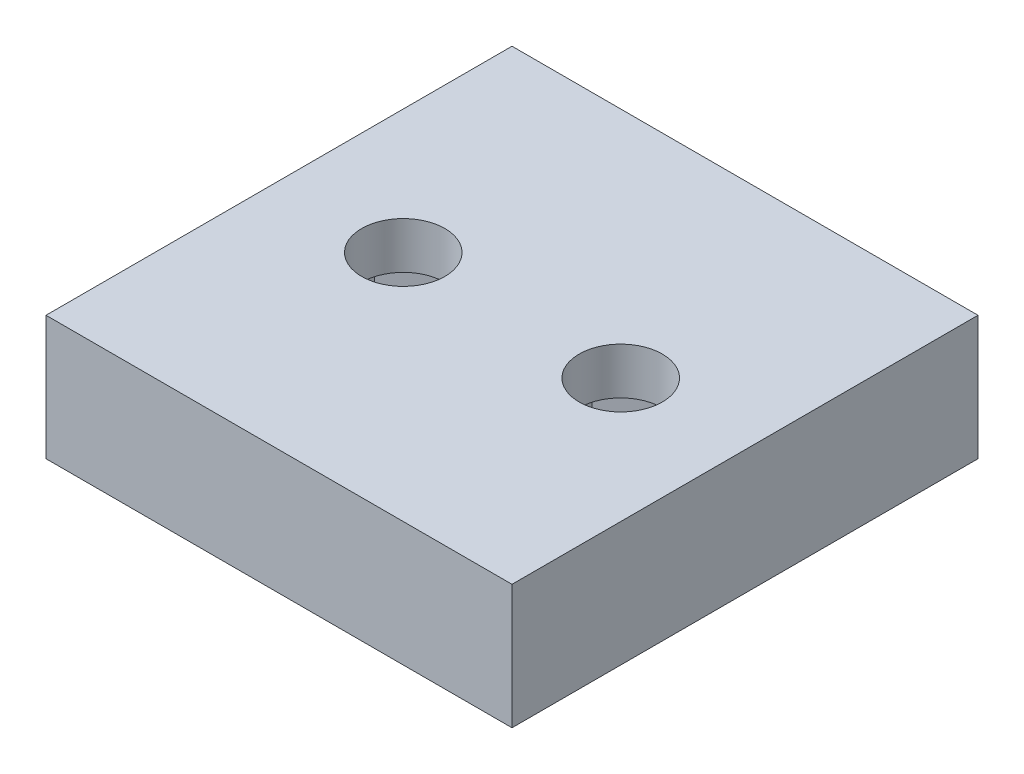
ISO-10303-21;
HEADER;
FILE_DESCRIPTION(('STEP AP214'),'2;1');
FILE_NAME('part.step','',(''),(''),'','','');
FILE_SCHEMA(('AUTOMOTIVE_DESIGN { 1 0 10303 214 1 1 1 1 }'));
ENDSEC;
DATA;
#1=APPLICATION_CONTEXT('core data for automotive mechanical design processes');
#2=APPLICATION_PROTOCOL_DEFINITION('international standard','automotive_design',2000,#1);
#3=PRODUCT_CONTEXT('',#1,'mechanical');
#4=PRODUCT('Part','Part','',(#3));
#5=PRODUCT_RELATED_PRODUCT_CATEGORY('part','',(#4));
#6=PRODUCT_DEFINITION_FORMATION('','',#4);
#7=PRODUCT_DEFINITION_CONTEXT('part definition',#1,'design');
#8=PRODUCT_DEFINITION('design','',#6,#7);
#9=PRODUCT_DEFINITION_SHAPE('','',#8);
#10=(LENGTH_UNIT() NAMED_UNIT(*) SI_UNIT(.MILLI.,.METRE.));
#11=(NAMED_UNIT(*) PLANE_ANGLE_UNIT() SI_UNIT($,.RADIAN.));
#12=(NAMED_UNIT(*) SI_UNIT($,.STERADIAN.) SOLID_ANGLE_UNIT());
#13=UNCERTAINTY_MEASURE_WITH_UNIT(LENGTH_MEASURE(1.E-05),#10,'distance_accuracy_value','');
#14=(GEOMETRIC_REPRESENTATION_CONTEXT(3) GLOBAL_UNCERTAINTY_ASSIGNED_CONTEXT((#13)) GLOBAL_UNIT_ASSIGNED_CONTEXT((#10,
#11,#12)) REPRESENTATION_CONTEXT('',''));
#15=CARTESIAN_POINT('',(0.,0.,0.));
#16=DIRECTION('',(0.,0.,1.));
#17=DIRECTION('',(1.,0.,0.));
#18=AXIS2_PLACEMENT_3D('',#15,#16,#17);
#19=CARTESIAN_POINT('',(-4.445,0.,0.));
#20=DIRECTION('',(0.,-1.,0.));
#21=DIRECTION('',(0.,0.,-1.));
#22=AXIS2_PLACEMENT_3D('',#19,#20,#21);
#23=CYLINDRICAL_SURFACE('',#22,1.7);
#24=CARTESIAN_POINT('',(-4.445,5.08,0.));
#25=DIRECTION('',(0.,-1.,0.));
#26=DIRECTION('',(0.,0.,-1.));
#27=AXIS2_PLACEMENT_3D('',#24,#25,#26);
#28=CIRCLE('',#27,1.7);
#29=CARTESIAN_POINT('',(-4.445,5.08,-1.7));
#30=VERTEX_POINT('',#29);
#31=EDGE_CURVE('E297',#30,#30,#28,.T.);
#32=ORIENTED_EDGE('',*,*,#31,.F.);
#33=EDGE_LOOP('',(#32));
#34=FACE_BOUND('',#33,.T.);
#35=CARTESIAN_POINT('',(-4.445,3.175,0.));
#36=DIRECTION('',(0.,-1.,0.));
#37=DIRECTION('',(0.,0.,-1.));
#38=AXIS2_PLACEMENT_3D('',#35,#36,#37);
#39=CIRCLE('',#38,1.7);
#40=CARTESIAN_POINT('',(-4.445,3.175,-1.7));
#41=VERTEX_POINT('',#40);
#42=EDGE_CURVE('E43',#41,#41,#39,.F.);
#43=ORIENTED_EDGE('',*,*,#42,.F.);
#44=EDGE_LOOP('',(#43));
#45=FACE_BOUND('',#44,.T.);
#46=ADVANCED_FACE('F39',(#34,#45),#23,.F.);
#47=CARTESIAN_POINT('',(4.445,0.,0.));
#48=DIRECTION('',(0.,-1.,0.));
#49=DIRECTION('',(0.,0.,-1.));
#50=AXIS2_PLACEMENT_3D('',#47,#48,#49);
#51=CYLINDRICAL_SURFACE('',#50,1.7);
#52=CARTESIAN_POINT('',(4.445,5.08,0.));
#53=DIRECTION('',(0.,-1.,0.));
#54=DIRECTION('',(0.,0.,-1.));
#55=AXIS2_PLACEMENT_3D('',#52,#53,#54);
#56=CIRCLE('',#55,1.7);
#57=CARTESIAN_POINT('',(4.445,5.08,-1.7));
#58=VERTEX_POINT('',#57);
#59=EDGE_CURVE('E293',#58,#58,#56,.T.);
#60=ORIENTED_EDGE('',*,*,#59,.F.);
#61=EDGE_LOOP('',(#60));
#62=FACE_BOUND('',#61,.T.);
#63=CARTESIAN_POINT('',(4.445,3.175,0.));
#64=DIRECTION('',(0.,-1.,0.));
#65=DIRECTION('',(0.,0.,-1.));
#66=AXIS2_PLACEMENT_3D('',#63,#64,#65);
#67=CIRCLE('',#66,1.7);
#68=CARTESIAN_POINT('',(4.445,3.175,-1.7));
#69=VERTEX_POINT('',#68);
#70=EDGE_CURVE('E218',#69,#69,#67,.F.);
#71=ORIENTED_EDGE('',*,*,#70,.F.);
#72=EDGE_LOOP('',(#71));
#73=FACE_BOUND('',#72,.T.);
#74=ADVANCED_FACE('F346',(#62,#73),#51,.F.);
#75=CARTESIAN_POINT('',(-9.525,5.08,-9.525));
#76=DIRECTION('',(1.,0.,0.));
#77=DIRECTION('',(0.,0.,-1.));
#78=AXIS2_PLACEMENT_3D('',#75,#76,#77);
#79=PLANE('',#78);
#80=DIRECTION('',(0.,0.,1.));
#81=VECTOR('',#80,1.);
#82=CARTESIAN_POINT('',(-9.525,0.,-9.525));
#83=LINE('',#82,#81);
#84=CARTESIAN_POINT('',(-9.525,0.,-9.525));
#85=VERTEX_POINT('',#84);
#86=CARTESIAN_POINT('',(-9.525,0.,9.525));
#87=VERTEX_POINT('',#86);
#88=EDGE_CURVE('E301',#85,#87,#83,.T.);
#89=ORIENTED_EDGE('',*,*,#88,.T.);
#90=DIRECTION('',(0.,-1.,0.));
#91=VECTOR('',#90,1.);
#92=CARTESIAN_POINT('',(-9.525,5.08,9.525));
#93=LINE('',#92,#91);
#94=CARTESIAN_POINT('',(-9.525,5.08,9.525));
#95=VERTEX_POINT('',#94);
#96=EDGE_CURVE('E11',#95,#87,#93,.T.);
#97=ORIENTED_EDGE('',*,*,#96,.F.);
#98=DIRECTION('',(0.,0.,1.));
#99=VECTOR('',#98,1.);
#100=CARTESIAN_POINT('',(-9.525,5.08,-9.525));
#101=LINE('',#100,#99);
#102=CARTESIAN_POINT('',(-9.525,5.08,-9.525));
#103=VERTEX_POINT('',#102);
#104=EDGE_CURVE('E302',#103,#95,#101,.T.);
#105=ORIENTED_EDGE('',*,*,#104,.F.);
#106=DIRECTION('',(0.,-1.,0.));
#107=VECTOR('',#106,1.);
#108=CARTESIAN_POINT('',(-9.525,5.08,-9.525));
#109=LINE('',#108,#107);
#110=EDGE_CURVE('E316',#103,#85,#109,.T.);
#111=ORIENTED_EDGE('',*,*,#110,.T.);
#112=EDGE_LOOP('',(#89,#97,#105,#111));
#113=FACE_BOUND('',#112,.T.);
#114=ADVANCED_FACE('F41',(#113),#79,.F.);
#115=CARTESIAN_POINT('',(9.525,5.08,9.525));
#116=DIRECTION('',(0.,0.,-1.));
#117=DIRECTION('',(-1.,0.,0.));
#118=AXIS2_PLACEMENT_3D('',#115,#116,#117);
#119=PLANE('',#118);
#120=DIRECTION('',(1.,0.,0.));
#121=VECTOR('',#120,1.);
#122=CARTESIAN_POINT('',(9.525,0.,9.525));
#123=LINE('',#122,#121);
#124=CARTESIAN_POINT('',(9.525,0.,9.525));
#125=VERTEX_POINT('',#124);
#126=EDGE_CURVE('E320',#87,#125,#123,.T.);
#127=ORIENTED_EDGE('',*,*,#126,.T.);
#128=DIRECTION('',(0.,-1.,0.));
#129=VECTOR('',#128,1.);
#130=CARTESIAN_POINT('',(9.525,5.08,9.525));
#131=LINE('',#130,#129);
#132=CARTESIAN_POINT('',(9.525,5.08,9.525));
#133=VERTEX_POINT('',#132);
#134=EDGE_CURVE('E49',#133,#125,#131,.T.);
#135=ORIENTED_EDGE('',*,*,#134,.F.);
#136=DIRECTION('',(1.,0.,0.));
#137=VECTOR('',#136,1.);
#138=CARTESIAN_POINT('',(9.525,5.08,9.525));
#139=LINE('',#138,#137);
#140=EDGE_CURVE('E306',#95,#133,#139,.T.);
#141=ORIENTED_EDGE('',*,*,#140,.F.);
#142=ORIENTED_EDGE('',*,*,#96,.T.);
#143=EDGE_LOOP('',(#127,#135,#141,#142));
#144=FACE_BOUND('',#143,.T.);
#145=ADVANCED_FACE('F372',(#144),#119,.F.);
#146=CARTESIAN_POINT('',(9.525,5.08,-9.525));
#147=DIRECTION('',(-1.,0.,0.));
#148=DIRECTION('',(0.,0.,1.));
#149=AXIS2_PLACEMENT_3D('',#146,#147,#148);
#150=PLANE('',#149);
#151=DIRECTION('',(0.,0.,-1.));
#152=VECTOR('',#151,1.);
#153=CARTESIAN_POINT('',(9.525,0.,-9.525));
#154=LINE('',#153,#152);
#155=CARTESIAN_POINT('',(9.525,0.,-9.525));
#156=VERTEX_POINT('',#155);
#157=EDGE_CURVE('E323',#125,#156,#154,.T.);
#158=ORIENTED_EDGE('',*,*,#157,.T.);
#159=DIRECTION('',(0.,-1.,0.));
#160=VECTOR('',#159,1.);
#161=CARTESIAN_POINT('',(9.525,5.08,-9.525));
#162=LINE('',#161,#160);
#163=CARTESIAN_POINT('',(9.525,5.08,-9.525));
#164=VERTEX_POINT('',#163);
#165=EDGE_CURVE('E331',#164,#156,#162,.T.);
#166=ORIENTED_EDGE('',*,*,#165,.F.);
#167=DIRECTION('',(0.,0.,-1.));
#168=VECTOR('',#167,1.);
#169=CARTESIAN_POINT('',(9.525,5.08,-9.525));
#170=LINE('',#169,#168);
#171=EDGE_CURVE('E310',#133,#164,#170,.T.);
#172=ORIENTED_EDGE('',*,*,#171,.F.);
#173=ORIENTED_EDGE('',*,*,#134,.T.);
#174=EDGE_LOOP('',(#158,#166,#172,#173));
#175=FACE_BOUND('',#174,.T.);
#176=ADVANCED_FACE('F369',(#175),#150,.F.);
#177=CARTESIAN_POINT('',(9.525,5.08,-9.525));
#178=DIRECTION('',(0.,0.,1.));
#179=DIRECTION('',(1.,0.,0.));
#180=AXIS2_PLACEMENT_3D('',#177,#178,#179);
#181=PLANE('',#180);
#182=DIRECTION('',(-1.,0.,0.));
#183=VECTOR('',#182,1.);
#184=CARTESIAN_POINT('',(9.525,0.,-9.525));
#185=LINE('',#184,#183);
#186=EDGE_CURVE('E307',#156,#85,#185,.T.);
#187=ORIENTED_EDGE('',*,*,#186,.T.);
#188=ORIENTED_EDGE('',*,*,#110,.F.);
#189=DIRECTION('',(-1.,0.,0.));
#190=VECTOR('',#189,1.);
#191=CARTESIAN_POINT('',(9.525,5.08,-9.525));
#192=LINE('',#191,#190);
#193=EDGE_CURVE('E313',#164,#103,#192,.T.);
#194=ORIENTED_EDGE('',*,*,#193,.F.);
#195=ORIENTED_EDGE('',*,*,#165,.T.);
#196=EDGE_LOOP('',(#187,#188,#194,#195));
#197=FACE_BOUND('',#196,.T.);
#198=ADVANCED_FACE('F361',(#197),#181,.F.);
#199=CARTESIAN_POINT('',(0.,5.08,0.));
#200=DIRECTION('',(0.,-1.,0.));
#201=DIRECTION('',(0.,0.,-1.));
#202=AXIS2_PLACEMENT_3D('',#199,#200,#201);
#203=PLANE('',#202);
#204=ORIENTED_EDGE('',*,*,#59,.T.);
#205=EDGE_LOOP('',(#204));
#206=FACE_BOUND('',#205,.T.);
#207=ORIENTED_EDGE('',*,*,#31,.T.);
#208=EDGE_LOOP('',(#207));
#209=FACE_BOUND('',#208,.T.);
#210=ORIENTED_EDGE('',*,*,#104,.T.);
#211=ORIENTED_EDGE('',*,*,#140,.T.);
#212=ORIENTED_EDGE('',*,*,#171,.T.);
#213=ORIENTED_EDGE('',*,*,#193,.T.);
#214=EDGE_LOOP('',(#210,#211,#212,#213));
#215=FACE_BOUND('',#214,.T.);
#216=ADVANCED_FACE('F357',(#206,#209,#215),#203,.F.);
#217=CARTESIAN_POINT('',(0.,0.,0.));
#218=DIRECTION('',(0.,-1.,0.));
#219=DIRECTION('',(0.,0.,-1.));
#220=AXIS2_PLACEMENT_3D('',#217,#218,#219);
#221=PLANE('',#220);
#222=DIRECTION('',(0.,0.,-1.));
#223=VECTOR('',#222,1.);
#224=CARTESIAN_POINT('',(-7.239,0.,1.61311665211581));
#225=LINE('',#224,#223);
#226=CARTESIAN_POINT('',(-7.239,0.,1.61311665211581));
#227=VERTEX_POINT('',#226);
#228=CARTESIAN_POINT('',(-7.239,0.,-1.61311665211582));
#229=VERTEX_POINT('',#228);
#230=EDGE_CURVE('E57',#227,#229,#225,.T.);
#231=ORIENTED_EDGE('',*,*,#230,.F.);
#232=DIRECTION('',(-0.866025403784439,0.,-0.5));
#233=VECTOR('',#232,1.);
#234=CARTESIAN_POINT('',(-4.445,0.,3.22623330423163));
#235=LINE('',#234,#233);
#236=CARTESIAN_POINT('',(-4.445,0.,3.22623330423163));
#237=VERTEX_POINT('',#236);
#238=EDGE_CURVE('E180',#237,#227,#235,.T.);
#239=ORIENTED_EDGE('',*,*,#238,.F.);
#240=DIRECTION('',(-0.866025403784439,0.,0.5));
#241=VECTOR('',#240,1.);
#242=CARTESIAN_POINT('',(-1.651,0.,1.61311665211582));
#243=LINE('',#242,#241);
#244=CARTESIAN_POINT('',(-1.651,0.,1.61311665211582));
#245=VERTEX_POINT('',#244);
#246=EDGE_CURVE('E184',#245,#237,#243,.T.);
#247=ORIENTED_EDGE('',*,*,#246,.F.);
#248=DIRECTION('',(0.,0.,1.));
#249=VECTOR('',#248,1.);
#250=CARTESIAN_POINT('',(-1.651,0.,-1.61311665211581));
#251=LINE('',#250,#249);
#252=CARTESIAN_POINT('',(-1.651,0.,-1.61311665211581));
#253=VERTEX_POINT('',#252);
#254=EDGE_CURVE('E208',#253,#245,#251,.T.);
#255=ORIENTED_EDGE('',*,*,#254,.F.);
#256=DIRECTION('',(0.866025403784438,0.,0.5));
#257=VECTOR('',#256,1.);
#258=CARTESIAN_POINT('',(-4.445,0.,-3.22623330423163));
#259=LINE('',#258,#257);
#260=CARTESIAN_POINT('',(-4.445,0.,-3.22623330423163));
#261=VERTEX_POINT('',#260);
#262=EDGE_CURVE('E204',#261,#253,#259,.T.);
#263=ORIENTED_EDGE('',*,*,#262,.F.);
#264=DIRECTION('',(0.866025403784439,0.,-0.5));
#265=VECTOR('',#264,1.);
#266=CARTESIAN_POINT('',(-7.239,0.,-1.61311665211581));
#267=LINE('',#266,#265);
#268=EDGE_CURVE('E200',#229,#261,#267,.T.);
#269=ORIENTED_EDGE('',*,*,#268,.F.);
#270=EDGE_LOOP('',(#231,#239,#247,#255,#263,#269));
#271=FACE_BOUND('',#270,.T.);
#272=DIRECTION('',(0.866025403784439,0.,0.5));
#273=VECTOR('',#272,1.);
#274=CARTESIAN_POINT('',(4.445,0.,-3.22623330423163));
#275=LINE('',#274,#273);
#276=CARTESIAN_POINT('',(4.445,0.,-3.22623330423163));
#277=VERTEX_POINT('',#276);
#278=CARTESIAN_POINT('',(7.239,0.,-1.61311665211581));
#279=VERTEX_POINT('',#278);
#280=EDGE_CURVE('E65',#277,#279,#275,.T.);
#281=ORIENTED_EDGE('',*,*,#280,.F.);
#282=DIRECTION('',(0.866025403784439,0.,-0.5));
#283=VECTOR('',#282,1.);
#284=CARTESIAN_POINT('',(1.651,0.,-1.61311665211581));
#285=LINE('',#284,#283);
#286=CARTESIAN_POINT('',(1.651,0.,-1.61311665211581));
#287=VERTEX_POINT('',#286);
#288=EDGE_CURVE('E235',#287,#277,#285,.T.);
#289=ORIENTED_EDGE('',*,*,#288,.F.);
#290=DIRECTION('',(0.,0.,-1.));
#291=VECTOR('',#290,1.);
#292=CARTESIAN_POINT('',(1.651,0.,1.61311665211582));
#293=LINE('',#292,#291);
#294=CARTESIAN_POINT('',(1.651,0.,1.61311665211582));
#295=VERTEX_POINT('',#294);
#296=EDGE_CURVE('E270',#295,#287,#293,.T.);
#297=ORIENTED_EDGE('',*,*,#296,.F.);
#298=DIRECTION('',(-0.866025403784439,0.,-0.5));
#299=VECTOR('',#298,1.);
#300=CARTESIAN_POINT('',(4.445,0.,3.22623330423163));
#301=LINE('',#300,#299);
#302=CARTESIAN_POINT('',(4.445,0.,3.22623330423163));
#303=VERTEX_POINT('',#302);
#304=EDGE_CURVE('E266',#303,#295,#301,.T.);
#305=ORIENTED_EDGE('',*,*,#304,.F.);
#306=DIRECTION('',(-0.866025403784439,0.,0.5));
#307=VECTOR('',#306,1.);
#308=CARTESIAN_POINT('',(7.239,0.,1.61311665211582));
#309=LINE('',#308,#307);
#310=CARTESIAN_POINT('',(7.239,0.,1.61311665211582));
#311=VERTEX_POINT('',#310);
#312=EDGE_CURVE('E262',#311,#303,#309,.T.);
#313=ORIENTED_EDGE('',*,*,#312,.F.);
#314=DIRECTION('',(0.,0.,1.));
#315=VECTOR('',#314,1.);
#316=CARTESIAN_POINT('',(7.239,0.,-1.61311665211581));
#317=LINE('',#316,#315);
#318=EDGE_CURVE('E258',#279,#311,#317,.T.);
#319=ORIENTED_EDGE('',*,*,#318,.F.);
#320=EDGE_LOOP('',(#281,#289,#297,#305,#313,#319));
#321=FACE_BOUND('',#320,.T.);
#322=ORIENTED_EDGE('',*,*,#88,.F.);
#323=ORIENTED_EDGE('',*,*,#186,.F.);
#324=ORIENTED_EDGE('',*,*,#157,.F.);
#325=ORIENTED_EDGE('',*,*,#126,.F.);
#326=EDGE_LOOP('',(#322,#323,#324,#325));
#327=FACE_BOUND('',#326,.T.);
#328=ADVANCED_FACE('F360',(#271,#321,#327),#221,.T.);
#329=CARTESIAN_POINT('',(0.,3.175,0.));
#330=DIRECTION('',(0.,-1.,0.));
#331=DIRECTION('',(0.,0.,-1.));
#332=AXIS2_PLACEMENT_3D('',#329,#330,#331);
#333=PLANE('',#332);
#334=DIRECTION('',(0.866025403784439,0.,0.5));
#335=VECTOR('',#334,1.);
#336=CARTESIAN_POINT('',(4.445,3.175,-3.22623330423163));
#337=LINE('',#336,#335);
#338=CARTESIAN_POINT('',(4.445,3.175,-3.22623330423163));
#339=VERTEX_POINT('',#338);
#340=CARTESIAN_POINT('',(7.239,3.175,-1.61311665211581));
#341=VERTEX_POINT('',#340);
#342=EDGE_CURVE('E230',#339,#341,#337,.T.);
#343=ORIENTED_EDGE('',*,*,#342,.T.);
#344=DIRECTION('',(0.,0.,1.));
#345=VECTOR('',#344,1.);
#346=CARTESIAN_POINT('',(7.239,3.175,-1.61311665211581));
#347=LINE('',#346,#345);
#348=CARTESIAN_POINT('',(7.239,3.175,1.61311665211582));
#349=VERTEX_POINT('',#348);
#350=EDGE_CURVE('E234',#341,#349,#347,.T.);
#351=ORIENTED_EDGE('',*,*,#350,.T.);
#352=DIRECTION('',(-0.866025403784439,0.,0.5));
#353=VECTOR('',#352,1.);
#354=CARTESIAN_POINT('',(7.239,3.175,1.61311665211582));
#355=LINE('',#354,#353);
#356=CARTESIAN_POINT('',(4.445,3.175,3.22623330423163));
#357=VERTEX_POINT('',#356);
#358=EDGE_CURVE('E239',#349,#357,#355,.T.);
#359=ORIENTED_EDGE('',*,*,#358,.T.);
#360=DIRECTION('',(-0.866025403784439,0.,-0.5));
#361=VECTOR('',#360,1.);
#362=CARTESIAN_POINT('',(4.445,3.175,3.22623330423163));
#363=LINE('',#362,#361);
#364=CARTESIAN_POINT('',(1.651,3.175,1.61311665211582));
#365=VERTEX_POINT('',#364);
#366=EDGE_CURVE('E243',#357,#365,#363,.T.);
#367=ORIENTED_EDGE('',*,*,#366,.T.);
#368=DIRECTION('',(0.,0.,-1.));
#369=VECTOR('',#368,1.);
#370=CARTESIAN_POINT('',(1.651,3.175,1.61311665211582));
#371=LINE('',#370,#369);
#372=CARTESIAN_POINT('',(1.651,3.175,-1.61311665211581));
#373=VERTEX_POINT('',#372);
#374=EDGE_CURVE('E247',#365,#373,#371,.T.);
#375=ORIENTED_EDGE('',*,*,#374,.T.);
#376=DIRECTION('',(0.866025403784439,0.,-0.5));
#377=VECTOR('',#376,1.);
#378=CARTESIAN_POINT('',(1.651,3.175,-1.61311665211581));
#379=LINE('',#378,#377);
#380=EDGE_CURVE('E251',#373,#339,#379,.T.);
#381=ORIENTED_EDGE('',*,*,#380,.T.);
#382=EDGE_LOOP('',(#343,#351,#359,#367,#375,#381));
#383=FACE_BOUND('',#382,.T.);
#384=ORIENTED_EDGE('',*,*,#70,.T.);
#385=EDGE_LOOP('',(#384));
#386=FACE_BOUND('',#385,.T.);
#387=ADVANCED_FACE('F365',(#383,#386),#333,.T.);
#388=CARTESIAN_POINT('',(4.445,3.175,-3.22623330423163));
#389=DIRECTION('',(0.5,0.,-0.866025403784439));
#390=DIRECTION('',(-0.866025403784439,0.,-0.5));
#391=AXIS2_PLACEMENT_3D('',#388,#389,#390);
#392=PLANE('',#391);
#393=ORIENTED_EDGE('',*,*,#280,.T.);
#394=DIRECTION('',(0.,-1.,0.));
#395=VECTOR('',#394,1.);
#396=CARTESIAN_POINT('',(7.239,3.175,-1.61311665211581));
#397=LINE('',#396,#395);
#398=EDGE_CURVE('E255',#341,#279,#397,.T.);
#399=ORIENTED_EDGE('',*,*,#398,.F.);
#400=ORIENTED_EDGE('',*,*,#342,.F.);
#401=DIRECTION('',(0.,-1.,0.));
#402=VECTOR('',#401,1.);
#403=CARTESIAN_POINT('',(4.445,3.175,-3.22623330423163));
#404=LINE('',#403,#402);
#405=EDGE_CURVE('E201',#339,#277,#404,.T.);
#406=ORIENTED_EDGE('',*,*,#405,.T.);
#407=EDGE_LOOP('',(#393,#399,#400,#406));
#408=FACE_BOUND('',#407,.T.);
#409=ADVANCED_FACE('F417',(#408),#392,.F.);
#410=CARTESIAN_POINT('',(1.651,3.175,-1.61311665211581));
#411=DIRECTION('',(-0.5,0.,-0.866025403784439));
#412=DIRECTION('',(-0.866025403784439,0.,0.5));
#413=AXIS2_PLACEMENT_3D('',#410,#411,#412);
#414=PLANE('',#413);
#415=ORIENTED_EDGE('',*,*,#288,.T.);
#416=ORIENTED_EDGE('',*,*,#405,.F.);
#417=ORIENTED_EDGE('',*,*,#380,.F.);
#418=DIRECTION('',(0.,-1.,0.));
#419=VECTOR('',#418,1.);
#420=CARTESIAN_POINT('',(1.651,3.175,-1.61311665211581));
#421=LINE('',#420,#419);
#422=EDGE_CURVE('E279',#373,#287,#421,.T.);
#423=ORIENTED_EDGE('',*,*,#422,.T.);
#424=EDGE_LOOP('',(#415,#416,#417,#423));
#425=FACE_BOUND('',#424,.T.);
#426=ADVANCED_FACE('F427',(#425),#414,.F.);
#427=CARTESIAN_POINT('',(1.651,3.175,1.61311665211582));
#428=DIRECTION('',(-1.,0.,0.));
#429=DIRECTION('',(0.,0.,1.));
#430=AXIS2_PLACEMENT_3D('',#427,#428,#429);
#431=PLANE('',#430);
#432=ORIENTED_EDGE('',*,*,#296,.T.);
#433=ORIENTED_EDGE('',*,*,#422,.F.);
#434=ORIENTED_EDGE('',*,*,#374,.F.);
#435=DIRECTION('',(0.,-1.,0.));
#436=VECTOR('',#435,1.);
#437=CARTESIAN_POINT('',(1.651,3.175,1.61311665211582));
#438=LINE('',#437,#436);
#439=EDGE_CURVE('E282',#365,#295,#438,.T.);
#440=ORIENTED_EDGE('',*,*,#439,.T.);
#441=EDGE_LOOP('',(#432,#433,#434,#440));
#442=FACE_BOUND('',#441,.T.);
#443=ADVANCED_FACE('F435',(#442),#431,.F.);
#444=CARTESIAN_POINT('',(4.445,3.175,3.22623330423163));
#445=DIRECTION('',(-0.5,0.,0.866025403784439));
#446=DIRECTION('',(0.866025403784439,0.,0.5));
#447=AXIS2_PLACEMENT_3D('',#444,#445,#446);
#448=PLANE('',#447);
#449=ORIENTED_EDGE('',*,*,#304,.T.);
#450=ORIENTED_EDGE('',*,*,#439,.F.);
#451=ORIENTED_EDGE('',*,*,#366,.F.);
#452=DIRECTION('',(0.,-1.,0.));
#453=VECTOR('',#452,1.);
#454=CARTESIAN_POINT('',(4.445,3.175,3.22623330423163));
#455=LINE('',#454,#453);
#456=EDGE_CURVE('E285',#357,#303,#455,.T.);
#457=ORIENTED_EDGE('',*,*,#456,.T.);
#458=EDGE_LOOP('',(#449,#450,#451,#457));
#459=FACE_BOUND('',#458,.T.);
#460=ADVANCED_FACE('F445',(#459),#448,.F.);
#461=CARTESIAN_POINT('',(7.239,3.175,1.61311665211582));
#462=DIRECTION('',(0.5,0.,0.866025403784439));
#463=DIRECTION('',(0.866025403784439,0.,-0.5));
#464=AXIS2_PLACEMENT_3D('',#461,#462,#463);
#465=PLANE('',#464);
#466=ORIENTED_EDGE('',*,*,#312,.T.);
#467=ORIENTED_EDGE('',*,*,#456,.F.);
#468=ORIENTED_EDGE('',*,*,#358,.F.);
#469=DIRECTION('',(0.,-1.,0.));
#470=VECTOR('',#469,1.);
#471=CARTESIAN_POINT('',(7.239,3.175,1.61311665211582));
#472=LINE('',#471,#470);
#473=EDGE_CURVE('E288',#349,#311,#472,.T.);
#474=ORIENTED_EDGE('',*,*,#473,.T.);
#475=EDGE_LOOP('',(#466,#467,#468,#474));
#476=FACE_BOUND('',#475,.T.);
#477=ADVANCED_FACE('F455',(#476),#465,.F.);
#478=CARTESIAN_POINT('',(7.239,3.175,-1.61311665211581));
#479=DIRECTION('',(1.,0.,0.));
#480=DIRECTION('',(0.,0.,-1.));
#481=AXIS2_PLACEMENT_3D('',#478,#479,#480);
#482=PLANE('',#481);
#483=ORIENTED_EDGE('',*,*,#318,.T.);
#484=ORIENTED_EDGE('',*,*,#473,.F.);
#485=ORIENTED_EDGE('',*,*,#350,.F.);
#486=ORIENTED_EDGE('',*,*,#398,.T.);
#487=EDGE_LOOP('',(#483,#484,#485,#486));
#488=FACE_BOUND('',#487,.T.);
#489=ADVANCED_FACE('F465',(#488),#482,.F.);
#490=CARTESIAN_POINT('',(0.,3.175,0.));
#491=DIRECTION('',(0.,-1.,0.));
#492=DIRECTION('',(0.,0.,-1.));
#493=AXIS2_PLACEMENT_3D('',#490,#491,#492);
#494=PLANE('',#493);
#495=DIRECTION('',(0.,0.,-1.));
#496=VECTOR('',#495,1.);
#497=CARTESIAN_POINT('',(-7.239,3.175,1.61311665211581));
#498=LINE('',#497,#496);
#499=CARTESIAN_POINT('',(-7.239,3.175,1.61311665211581));
#500=VERTEX_POINT('',#499);
#501=CARTESIAN_POINT('',(-7.239,3.175,-1.61311665211581));
#502=VERTEX_POINT('',#501);
#503=EDGE_CURVE('E157',#500,#502,#498,.T.);
#504=ORIENTED_EDGE('',*,*,#503,.T.);
#505=DIRECTION('',(0.866025403784439,0.,-0.5));
#506=VECTOR('',#505,1.);
#507=CARTESIAN_POINT('',(-7.239,3.175,-1.61311665211581));
#508=LINE('',#507,#506);
#509=CARTESIAN_POINT('',(-4.445,3.175,-3.22623330423163));
#510=VERTEX_POINT('',#509);
#511=EDGE_CURVE('E167',#502,#510,#508,.T.);
#512=ORIENTED_EDGE('',*,*,#511,.T.);
#513=DIRECTION('',(0.866025403784438,0.,0.5));
#514=VECTOR('',#513,1.);
#515=CARTESIAN_POINT('',(-4.445,3.175,-3.22623330423163));
#516=LINE('',#515,#514);
#517=CARTESIAN_POINT('',(-1.651,3.175,-1.61311665211581));
#518=VERTEX_POINT('',#517);
#519=EDGE_CURVE('E173',#510,#518,#516,.T.);
#520=ORIENTED_EDGE('',*,*,#519,.T.);
#521=DIRECTION('',(0.,0.,1.));
#522=VECTOR('',#521,1.);
#523=CARTESIAN_POINT('',(-1.651,3.175,-1.61311665211581));
#524=LINE('',#523,#522);
#525=CARTESIAN_POINT('',(-1.651,3.175,1.61311665211582));
#526=VERTEX_POINT('',#525);
#527=EDGE_CURVE('E189',#518,#526,#524,.T.);
#528=ORIENTED_EDGE('',*,*,#527,.T.);
#529=DIRECTION('',(-0.866025403784439,0.,0.5));
#530=VECTOR('',#529,1.);
#531=CARTESIAN_POINT('',(-1.651,3.175,1.61311665211582));
#532=LINE('',#531,#530);
#533=CARTESIAN_POINT('',(-4.445,3.175,3.22623330423163));
#534=VERTEX_POINT('',#533);
#535=EDGE_CURVE('E193',#526,#534,#532,.T.);
#536=ORIENTED_EDGE('',*,*,#535,.T.);
#537=DIRECTION('',(-0.866025403784439,0.,-0.5));
#538=VECTOR('',#537,1.);
#539=CARTESIAN_POINT('',(-4.445,3.175,3.22623330423163));
#540=LINE('',#539,#538);
#541=EDGE_CURVE('E164',#534,#500,#540,.T.);
#542=ORIENTED_EDGE('',*,*,#541,.T.);
#543=EDGE_LOOP('',(#504,#512,#520,#528,#536,#542));
#544=FACE_BOUND('',#543,.T.);
#545=ORIENTED_EDGE('',*,*,#42,.T.);
#546=EDGE_LOOP('',(#545));
#547=FACE_BOUND('',#546,.T.);
#548=ADVANCED_FACE('F175',(#544,#547),#494,.T.);
#549=CARTESIAN_POINT('',(-7.239,3.175,1.61311665211581));
#550=DIRECTION('',(-1.,0.,0.));
#551=DIRECTION('',(0.,0.,1.));
#552=AXIS2_PLACEMENT_3D('',#549,#550,#551);
#553=PLANE('',#552);
#554=ORIENTED_EDGE('',*,*,#230,.T.);
#555=DIRECTION('',(0.,-1.,0.));
#556=VECTOR('',#555,1.);
#557=CARTESIAN_POINT('',(-7.239,3.175,-1.61311665211581));
#558=LINE('',#557,#556);
#559=EDGE_CURVE('E153',#502,#229,#558,.T.);
#560=ORIENTED_EDGE('',*,*,#559,.F.);
#561=ORIENTED_EDGE('',*,*,#503,.F.);
#562=DIRECTION('',(0.,-1.,0.));
#563=VECTOR('',#562,1.);
#564=CARTESIAN_POINT('',(-7.239,3.175,1.61311665211581));
#565=LINE('',#564,#563);
#566=EDGE_CURVE('E215',#500,#227,#565,.T.);
#567=ORIENTED_EDGE('',*,*,#566,.T.);
#568=EDGE_LOOP('',(#554,#560,#561,#567));
#569=FACE_BOUND('',#568,.T.);
#570=ADVANCED_FACE('F155',(#569),#553,.F.);
#571=CARTESIAN_POINT('',(-4.445,3.175,3.22623330423163));
#572=DIRECTION('',(-0.5,0.,0.866025403784439));
#573=DIRECTION('',(0.866025403784439,0.,0.5));
#574=AXIS2_PLACEMENT_3D('',#571,#572,#573);
#575=PLANE('',#574);
#576=ORIENTED_EDGE('',*,*,#238,.T.);
#577=ORIENTED_EDGE('',*,*,#566,.F.);
#578=ORIENTED_EDGE('',*,*,#541,.F.);
#579=DIRECTION('',(0.,-1.,0.));
#580=VECTOR('',#579,1.);
#581=CARTESIAN_POINT('',(-4.445,3.175,3.22623330423163));
#582=LINE('',#581,#580);
#583=EDGE_CURVE('E219',#534,#237,#582,.T.);
#584=ORIENTED_EDGE('',*,*,#583,.T.);
#585=EDGE_LOOP('',(#576,#577,#578,#584));
#586=FACE_BOUND('',#585,.T.);
#587=ADVANCED_FACE('F492',(#586),#575,.F.);
#588=CARTESIAN_POINT('',(-1.651,3.175,1.61311665211582));
#589=DIRECTION('',(0.5,0.,0.866025403784439));
#590=DIRECTION('',(0.866025403784439,0.,-0.5));
#591=AXIS2_PLACEMENT_3D('',#588,#589,#590);
#592=PLANE('',#591);
#593=ORIENTED_EDGE('',*,*,#246,.T.);
#594=ORIENTED_EDGE('',*,*,#583,.F.);
#595=ORIENTED_EDGE('',*,*,#535,.F.);
#596=DIRECTION('',(0.,-1.,0.));
#597=VECTOR('',#596,1.);
#598=CARTESIAN_POINT('',(-1.651,3.175,1.61311665211582));
#599=LINE('',#598,#597);
#600=EDGE_CURVE('E222',#526,#245,#599,.T.);
#601=ORIENTED_EDGE('',*,*,#600,.T.);
#602=EDGE_LOOP('',(#593,#594,#595,#601));
#603=FACE_BOUND('',#602,.T.);
#604=ADVANCED_FACE('F501',(#603),#592,.F.);
#605=CARTESIAN_POINT('',(-1.651,3.175,-1.61311665211581));
#606=DIRECTION('',(1.,0.,0.));
#607=DIRECTION('',(0.,0.,-1.));
#608=AXIS2_PLACEMENT_3D('',#605,#606,#607);
#609=PLANE('',#608);
#610=ORIENTED_EDGE('',*,*,#254,.T.);
#611=ORIENTED_EDGE('',*,*,#600,.F.);
#612=ORIENTED_EDGE('',*,*,#527,.F.);
#613=DIRECTION('',(0.,-1.,0.));
#614=VECTOR('',#613,1.);
#615=CARTESIAN_POINT('',(-1.651,3.175,-1.61311665211581));
#616=LINE('',#615,#614);
#617=EDGE_CURVE('E225',#518,#253,#616,.T.);
#618=ORIENTED_EDGE('',*,*,#617,.T.);
#619=EDGE_LOOP('',(#610,#611,#612,#618));
#620=FACE_BOUND('',#619,.T.);
#621=ADVANCED_FACE('F511',(#620),#609,.F.);
#622=CARTESIAN_POINT('',(-4.445,3.175,-3.22623330423163));
#623=DIRECTION('',(0.5,0.,-0.866025403784438));
#624=DIRECTION('',(-0.866025403784439,0.,-0.5));
#625=AXIS2_PLACEMENT_3D('',#622,#623,#624);
#626=PLANE('',#625);
#627=ORIENTED_EDGE('',*,*,#262,.T.);
#628=ORIENTED_EDGE('',*,*,#617,.F.);
#629=ORIENTED_EDGE('',*,*,#519,.F.);
#630=DIRECTION('',(0.,-1.,0.));
#631=VECTOR('',#630,1.);
#632=CARTESIAN_POINT('',(-4.445,3.175,-3.22623330423163));
#633=LINE('',#632,#631);
#634=EDGE_CURVE('E163',#510,#261,#633,.T.);
#635=ORIENTED_EDGE('',*,*,#634,.T.);
#636=EDGE_LOOP('',(#627,#628,#629,#635));
#637=FACE_BOUND('',#636,.T.);
#638=ADVANCED_FACE('F521',(#637),#626,.F.);
#639=CARTESIAN_POINT('',(-7.239,3.175,-1.61311665211581));
#640=DIRECTION('',(-0.5,0.,-0.866025403784438));
#641=DIRECTION('',(-0.866025403784439,0.,0.5));
#642=AXIS2_PLACEMENT_3D('',#639,#640,#641);
#643=PLANE('',#642);
#644=ORIENTED_EDGE('',*,*,#268,.T.);
#645=ORIENTED_EDGE('',*,*,#634,.F.);
#646=ORIENTED_EDGE('',*,*,#511,.F.);
#647=ORIENTED_EDGE('',*,*,#559,.T.);
#648=EDGE_LOOP('',(#644,#645,#646,#647));
#649=FACE_BOUND('',#648,.T.);
#650=ADVANCED_FACE('F168',(#649),#643,.F.);
#651=CLOSED_SHELL('',(#46,#74,#114,#145,#176,#198,#216,#328,#387,#409,#426,#443,#460,#477,#489,
#548,#570,#587,#604,#621,#638,#650));
#652=MANIFOLD_SOLID_BREP('B2',#651);
#653=ADVANCED_BREP_SHAPE_REPRESENTATION('',(#18,#652),#14);
#654=SHAPE_DEFINITION_REPRESENTATION(#9,#653);
ENDSEC;
END-ISO-10303-21;
